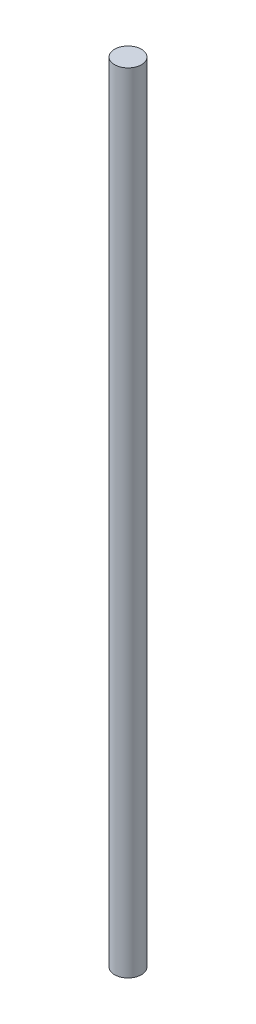
ISO-10303-21;
HEADER;
FILE_DESCRIPTION(('STEP AP214'),'2;1');
FILE_NAME('part.step','',(''),(''),'','','');
FILE_SCHEMA(('AUTOMOTIVE_DESIGN { 1 0 10303 214 1 1 1 1 }'));
ENDSEC;
DATA;
#1=APPLICATION_CONTEXT('core data for automotive mechanical design processes');
#2=APPLICATION_PROTOCOL_DEFINITION('international standard','automotive_design',2000,#1);
#3=PRODUCT_CONTEXT('',#1,'mechanical');
#4=PRODUCT('Part','Part','',(#3));
#5=PRODUCT_RELATED_PRODUCT_CATEGORY('part','',(#4));
#6=PRODUCT_DEFINITION_FORMATION('','',#4);
#7=PRODUCT_DEFINITION_CONTEXT('part definition',#1,'design');
#8=PRODUCT_DEFINITION('design','',#6,#7);
#9=PRODUCT_DEFINITION_SHAPE('','',#8);
#10=(LENGTH_UNIT() NAMED_UNIT(*) SI_UNIT(.MILLI.,.METRE.));
#11=(NAMED_UNIT(*) PLANE_ANGLE_UNIT() SI_UNIT($,.RADIAN.));
#12=(NAMED_UNIT(*) SI_UNIT($,.STERADIAN.) SOLID_ANGLE_UNIT());
#13=UNCERTAINTY_MEASURE_WITH_UNIT(LENGTH_MEASURE(1.E-05),#10,'distance_accuracy_value','');
#14=(GEOMETRIC_REPRESENTATION_CONTEXT(3) GLOBAL_UNCERTAINTY_ASSIGNED_CONTEXT((#13)) GLOBAL_UNIT_ASSIGNED_CONTEXT((#10,
#11,#12)) REPRESENTATION_CONTEXT('',''));
#15=CARTESIAN_POINT('',(0.,0.,0.));
#16=DIRECTION('',(0.,0.,1.));
#17=DIRECTION('',(1.,0.,0.));
#18=AXIS2_PLACEMENT_3D('',#15,#16,#17);
#19=CARTESIAN_POINT('',(0.,235.,0.));
#20=DIRECTION('',(0.,-1.,0.));
#21=DIRECTION('',(0.,0.,-1.));
#22=AXIS2_PLACEMENT_3D('',#19,#20,#21);
#23=CYLINDRICAL_SURFACE('',#22,4.);
#24=CARTESIAN_POINT('',(0.,235.,0.));
#25=DIRECTION('',(0.,1.,0.));
#26=DIRECTION('',(0.,0.,1.));
#27=AXIS2_PLACEMENT_3D('',#24,#25,#26);
#28=CIRCLE('',#27,4.);
#29=CARTESIAN_POINT('',(0.,235.,-4.));
#30=VERTEX_POINT('',#29);
#31=EDGE_CURVE('E10',#30,#30,#28,.T.);
#32=CARTESIAN_POINT('',(0.,0.,0.));
#33=DIRECTION('',(0.,1.,0.));
#34=DIRECTION('',(0.,0.,1.));
#35=AXIS2_PLACEMENT_3D('',#32,#33,#34);
#36=CIRCLE('',#35,4.);
#37=CARTESIAN_POINT('',(0.,0.,-4.));
#38=VERTEX_POINT('',#37);
#39=EDGE_CURVE('E39',#38,#38,#36,.T.);
#40=CARTESIAN_POINT('',(0.,235.,-4.));
#41=CARTESIAN_POINT('',(0.,232.552083333333,-4.));
#42=CARTESIAN_POINT('',(0.,230.104166666667,-4.));
#43=CARTESIAN_POINT('',(0.,225.208333333333,-4.));
#44=CARTESIAN_POINT('',(0.,222.760416666667,-4.));
#45=CARTESIAN_POINT('',(0.,217.864583333333,-4.));
#46=CARTESIAN_POINT('',(0.,215.416666666667,-4.));
#47=CARTESIAN_POINT('',(0.,210.520833333333,-4.));
#48=CARTESIAN_POINT('',(0.,208.072916666667,-4.));
#49=CARTESIAN_POINT('',(0.,203.177083333333,-4.));
#50=CARTESIAN_POINT('',(0.,200.729166666667,-4.));
#51=CARTESIAN_POINT('',(0.,195.833333333333,-4.));
#52=CARTESIAN_POINT('',(0.,193.385416666667,-4.));
#53=CARTESIAN_POINT('',(0.,188.489583333333,-4.));
#54=CARTESIAN_POINT('',(0.,186.041666666667,-4.));
#55=CARTESIAN_POINT('',(0.,181.145833333333,-4.));
#56=CARTESIAN_POINT('',(0.,178.697916666667,-4.));
#57=CARTESIAN_POINT('',(0.,173.802083333333,-4.));
#58=CARTESIAN_POINT('',(0.,171.354166666667,-4.));
#59=CARTESIAN_POINT('',(0.,166.458333333333,-4.));
#60=CARTESIAN_POINT('',(0.,164.010416666667,-4.));
#61=CARTESIAN_POINT('',(0.,159.114583333333,-4.));
#62=CARTESIAN_POINT('',(0.,156.666666666667,-4.));
#63=CARTESIAN_POINT('',(0.,151.770833333333,-4.));
#64=CARTESIAN_POINT('',(0.,149.322916666667,-4.));
#65=CARTESIAN_POINT('',(0.,144.427083333333,-4.));
#66=CARTESIAN_POINT('',(0.,141.979166666667,-4.));
#67=CARTESIAN_POINT('',(0.,137.083333333333,-4.));
#68=CARTESIAN_POINT('',(0.,134.635416666667,-4.));
#69=CARTESIAN_POINT('',(0.,129.739583333333,-4.));
#70=CARTESIAN_POINT('',(0.,127.291666666667,-4.));
#71=CARTESIAN_POINT('',(0.,122.395833333333,-4.));
#72=CARTESIAN_POINT('',(0.,119.947916666667,-4.));
#73=CARTESIAN_POINT('',(0.,115.052083333333,-4.));
#74=CARTESIAN_POINT('',(0.,112.604166666667,-4.));
#75=CARTESIAN_POINT('',(0.,107.708333333333,-4.));
#76=CARTESIAN_POINT('',(0.,105.260416666667,-4.));
#77=CARTESIAN_POINT('',(0.,100.364583333333,-4.));
#78=CARTESIAN_POINT('',(0.,97.9166666666667,-4.));
#79=CARTESIAN_POINT('',(0.,93.0208333333333,-4.));
#80=CARTESIAN_POINT('',(0.,90.5729166666667,-4.));
#81=CARTESIAN_POINT('',(0.,85.6770833333333,-4.));
#82=CARTESIAN_POINT('',(0.,83.2291666666667,-4.));
#83=CARTESIAN_POINT('',(0.,78.3333333333333,-4.));
#84=CARTESIAN_POINT('',(0.,75.8854166666667,-4.));
#85=CARTESIAN_POINT('',(0.,70.9895833333333,-4.));
#86=CARTESIAN_POINT('',(0.,68.5416666666667,-4.));
#87=CARTESIAN_POINT('',(0.,63.6458333333333,-4.));
#88=CARTESIAN_POINT('',(0.,61.1979166666667,-4.));
#89=CARTESIAN_POINT('',(0.,56.3020833333333,-4.));
#90=CARTESIAN_POINT('',(0.,53.8541666666667,-4.));
#91=CARTESIAN_POINT('',(0.,48.9583333333333,-4.));
#92=CARTESIAN_POINT('',(0.,46.5104166666667,-4.));
#93=CARTESIAN_POINT('',(0.,41.6145833333333,-4.));
#94=CARTESIAN_POINT('',(0.,39.1666666666666,-4.));
#95=CARTESIAN_POINT('',(0.,34.2708333333333,-4.));
#96=CARTESIAN_POINT('',(0.,31.8229166666666,-4.));
#97=CARTESIAN_POINT('',(0.,26.9270833333333,-4.));
#98=CARTESIAN_POINT('',(0.,24.4791666666666,-4.));
#99=CARTESIAN_POINT('',(0.,19.5833333333333,-4.));
#100=CARTESIAN_POINT('',(0.,17.1354166666666,-4.));
#101=CARTESIAN_POINT('',(0.,12.2395833333333,-4.));
#102=CARTESIAN_POINT('',(0.,9.79166666666664,-4.));
#103=CARTESIAN_POINT('',(0.,4.89583333333331,-4.));
#104=CARTESIAN_POINT('',(0.,2.44791666666664,-4.));
#105=CARTESIAN_POINT('',(0.,0.,-4.));
#106=B_SPLINE_CURVE_WITH_KNOTS('',3,(#40,#41,#42,#43,#44,#45,#46,#47,#48,#49,#50,#51,#52,#53,
#54,#55,#56,#57,#58,#59,#60,#61,#62,#63,#64,#65,#66,#67,#68,#69,#70,#71,#72,#73,#74,#75,#76,#77,
#78,#79,#80,#81,#82,#83,#84,#85,#86,#87,#88,#89,#90,#91,#92,#93,#94,#95,#96,#97,#98,#99,#100,
#101,#102,#103,#104,#105),.UNSPECIFIED.,.F.,.F.,(4,2,2,2,2,2,2,2,2,2,2,2,2,2,2,2,2,2,2,2,2,2,2,
2,2,2,2,2,2,2,2,2,4),(0.,7.34375000000001,14.6875,22.03125,29.375,36.71875,44.0625,51.40625,
58.75,66.09375,73.4375,80.78125,88.125,95.46875,102.8125,110.15625,117.5,124.84375,132.1875,
139.53125,146.875,154.21875,161.5625,168.90625,176.25,183.59375,190.9375,198.28125,205.625,
212.96875,220.3125,227.65625,235.),.UNSPECIFIED.);
#107=EDGE_CURVE('BSEAM36',#30,#38,#106,.T.);
#108=ORIENTED_EDGE('',*,*,#31,.F.);
#109=ORIENTED_EDGE('',*,*,#39,.T.);
#110=ORIENTED_EDGE('',*,*,#107,.T.);
#111=ORIENTED_EDGE('',*,*,#107,.F.);
#112=EDGE_LOOP('',(#108,#110,#109,#111));
#113=FACE_BOUND('',#112,.T.);
#114=ADVANCED_FACE('F36',(#113),#23,.T.);
#115=CARTESIAN_POINT('',(0.,235.,0.));
#116=DIRECTION('',(0.,1.,0.));
#117=DIRECTION('',(0.,0.,1.));
#118=AXIS2_PLACEMENT_3D('',#115,#116,#117);
#119=PLANE('',#118);
#120=ORIENTED_EDGE('',*,*,#31,.T.);
#121=EDGE_LOOP('',(#120));
#122=FACE_BOUND('',#121,.T.);
#123=ADVANCED_FACE('F51',(#122),#119,.T.);
#124=CARTESIAN_POINT('',(0.,0.,0.));
#125=DIRECTION('',(0.,1.,0.));
#126=DIRECTION('',(0.,0.,1.));
#127=AXIS2_PLACEMENT_3D('',#124,#125,#126);
#128=PLANE('',#127);
#129=ORIENTED_EDGE('',*,*,#39,.F.);
#130=EDGE_LOOP('',(#129));
#131=FACE_BOUND('',#130,.T.);
#132=ADVANCED_FACE('F49',(#131),#128,.F.);
#133=CLOSED_SHELL('',(#114,#123,#132));
#134=MANIFOLD_SOLID_BREP('B2',#133);
#135=ADVANCED_BREP_SHAPE_REPRESENTATION('',(#18,#134),#14);
#136=SHAPE_DEFINITION_REPRESENTATION(#9,#135);
ENDSEC;
END-ISO-10303-21;
